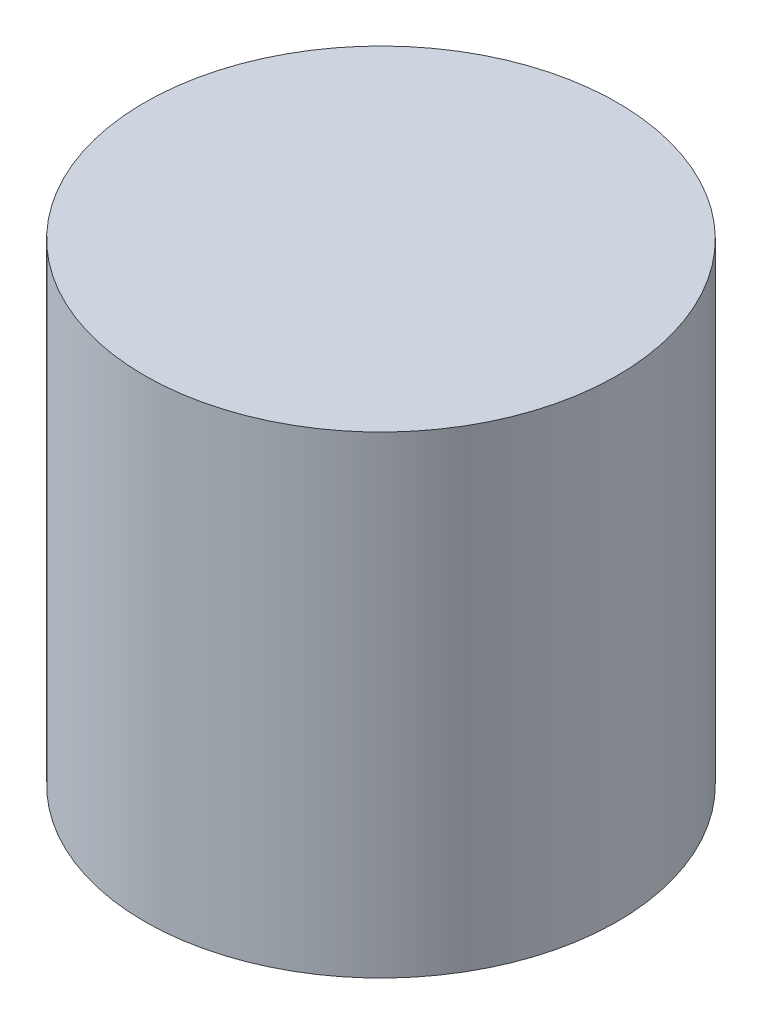
ISO-10303-21;
HEADER;
FILE_DESCRIPTION(('STEP AP214'),'2;1');
FILE_NAME('part.step','',(''),(''),'','','');
FILE_SCHEMA(('AUTOMOTIVE_DESIGN { 1 0 10303 214 1 1 1 1 }'));
ENDSEC;
DATA;
#1=APPLICATION_CONTEXT('core data for automotive mechanical design processes');
#2=APPLICATION_PROTOCOL_DEFINITION('international standard','automotive_design',2000,#1);
#3=PRODUCT_CONTEXT('',#1,'mechanical');
#4=PRODUCT('Part','Part','',(#3));
#5=PRODUCT_RELATED_PRODUCT_CATEGORY('part','',(#4));
#6=PRODUCT_DEFINITION_FORMATION('','',#4);
#7=PRODUCT_DEFINITION_CONTEXT('part definition',#1,'design');
#8=PRODUCT_DEFINITION('design','',#6,#7);
#9=PRODUCT_DEFINITION_SHAPE('','',#8);
#10=(LENGTH_UNIT() NAMED_UNIT(*) SI_UNIT(.MILLI.,.METRE.));
#11=(NAMED_UNIT(*) PLANE_ANGLE_UNIT() SI_UNIT($,.RADIAN.));
#12=(NAMED_UNIT(*) SI_UNIT($,.STERADIAN.) SOLID_ANGLE_UNIT());
#13=UNCERTAINTY_MEASURE_WITH_UNIT(LENGTH_MEASURE(1.E-05),#10,'distance_accuracy_value','');
#14=(GEOMETRIC_REPRESENTATION_CONTEXT(3) GLOBAL_UNCERTAINTY_ASSIGNED_CONTEXT((#13)) GLOBAL_UNIT_ASSIGNED_CONTEXT((#10,
#11,#12)) REPRESENTATION_CONTEXT('',''));
#15=CARTESIAN_POINT('',(0.,0.,0.));
#16=DIRECTION('',(0.,0.,1.));
#17=DIRECTION('',(1.,0.,0.));
#18=AXIS2_PLACEMENT_3D('',#15,#16,#17);
#19=CARTESIAN_POINT('',(0.,1.,0.));
#20=DIRECTION('',(0.,-1.,0.));
#21=DIRECTION('',(0.,0.,-1.));
#22=AXIS2_PLACEMENT_3D('',#19,#20,#21);
#23=CYLINDRICAL_SURFACE('',#22,0.5);
#24=CARTESIAN_POINT('',(0.,1.,0.));
#25=DIRECTION('',(0.,1.,0.));
#26=DIRECTION('',(0.,0.,1.));
#27=AXIS2_PLACEMENT_3D('',#24,#25,#26);
#28=CIRCLE('',#27,0.5);
#29=CARTESIAN_POINT('',(0.,1.,0.5));
#30=VERTEX_POINT('',#29);
#31=EDGE_CURVE('E10',#30,#30,#28,.T.);
#32=ORIENTED_EDGE('',*,*,#31,.F.);
#33=EDGE_LOOP('',(#32));
#34=FACE_BOUND('',#33,.T.);
#35=CARTESIAN_POINT('',(0.,0.,0.));
#36=DIRECTION('',(0.,1.,0.));
#37=DIRECTION('',(0.,0.,1.));
#38=AXIS2_PLACEMENT_3D('',#35,#36,#37);
#39=CIRCLE('',#38,0.5);
#40=CARTESIAN_POINT('',(0.,0.,0.5));
#41=VERTEX_POINT('',#40);
#42=EDGE_CURVE('E34',#41,#41,#39,.T.);
#43=ORIENTED_EDGE('',*,*,#42,.T.);
#44=EDGE_LOOP('',(#43));
#45=FACE_BOUND('',#44,.T.);
#46=ADVANCED_FACE('F31',(#34,#45),#23,.T.);
#47=CARTESIAN_POINT('',(0.,1.,0.));
#48=DIRECTION('',(0.,1.,0.));
#49=DIRECTION('',(0.,0.,1.));
#50=AXIS2_PLACEMENT_3D('',#47,#48,#49);
#51=PLANE('',#50);
#52=ORIENTED_EDGE('',*,*,#31,.T.);
#53=EDGE_LOOP('',(#52));
#54=FACE_BOUND('',#53,.T.);
#55=ADVANCED_FACE('F46',(#54),#51,.T.);
#56=CARTESIAN_POINT('',(0.,0.,0.));
#57=DIRECTION('',(0.,1.,0.));
#58=DIRECTION('',(0.,0.,1.));
#59=AXIS2_PLACEMENT_3D('',#56,#57,#58);
#60=PLANE('',#59);
#61=ORIENTED_EDGE('',*,*,#42,.F.);
#62=EDGE_LOOP('',(#61));
#63=FACE_BOUND('',#62,.T.);
#64=ADVANCED_FACE('F44',(#63),#60,.F.);
#65=CLOSED_SHELL('',(#46,#55,#64));
#66=MANIFOLD_SOLID_BREP('B2',#65);
#67=ADVANCED_BREP_SHAPE_REPRESENTATION('',(#18,#66),#14);
#68=SHAPE_DEFINITION_REPRESENTATION(#9,#67);
ENDSEC;
END-ISO-10303-21;
